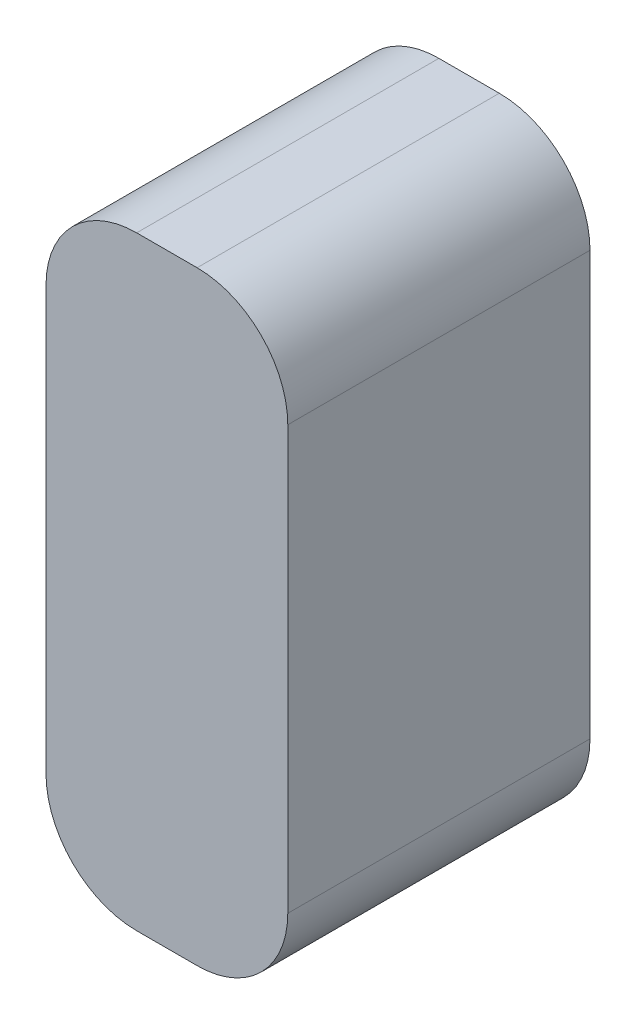
ISO-10303-21;
HEADER;
FILE_DESCRIPTION(('STEP AP214'),'2;1');
FILE_NAME('part.step','',(''),(''),'','','');
FILE_SCHEMA(('AUTOMOTIVE_DESIGN { 1 0 10303 214 1 1 1 1 }'));
ENDSEC;
DATA;
#1=APPLICATION_CONTEXT('core data for automotive mechanical design processes');
#2=APPLICATION_PROTOCOL_DEFINITION('international standard','automotive_design',2000,#1);
#3=PRODUCT_CONTEXT('',#1,'mechanical');
#4=PRODUCT('Part','Part','',(#3));
#5=PRODUCT_RELATED_PRODUCT_CATEGORY('part','',(#4));
#6=PRODUCT_DEFINITION_FORMATION('','',#4);
#7=PRODUCT_DEFINITION_CONTEXT('part definition',#1,'design');
#8=PRODUCT_DEFINITION('design','',#6,#7);
#9=PRODUCT_DEFINITION_SHAPE('','',#8);
#10=(LENGTH_UNIT() NAMED_UNIT(*) SI_UNIT(.MILLI.,.METRE.));
#11=(NAMED_UNIT(*) PLANE_ANGLE_UNIT() SI_UNIT($,.RADIAN.));
#12=(NAMED_UNIT(*) SI_UNIT($,.STERADIAN.) SOLID_ANGLE_UNIT());
#13=UNCERTAINTY_MEASURE_WITH_UNIT(LENGTH_MEASURE(1.E-05),#10,'distance_accuracy_value','');
#14=(GEOMETRIC_REPRESENTATION_CONTEXT(3) GLOBAL_UNCERTAINTY_ASSIGNED_CONTEXT((#13)) GLOBAL_UNIT_ASSIGNED_CONTEXT((#10,
#11,#12)) REPRESENTATION_CONTEXT('',''));
#15=CARTESIAN_POINT('',(0.,0.,0.));
#16=DIRECTION('',(0.,0.,1.));
#17=DIRECTION('',(1.,0.,0.));
#18=AXIS2_PLACEMENT_3D('',#15,#16,#17);
#19=CARTESIAN_POINT('',(-4.,299.,10.));
#20=DIRECTION('',(1.,0.,0.));
#21=DIRECTION('',(0.,1.,0.));
#22=AXIS2_PLACEMENT_3D('',#19,#20,#21);
#23=PLANE('',#22);
#24=DIRECTION('',(0.,-1.,0.));
#25=VECTOR('',#24,1.);
#26=CARTESIAN_POINT('',(-4.,299.,0.));
#27=LINE('',#26,#25);
#28=CARTESIAN_POINT('',(-4.,296.,0.));
#29=VERTEX_POINT('',#28);
#30=CARTESIAN_POINT('',(-4.,282.,0.));
#31=VERTEX_POINT('',#30);
#32=EDGE_CURVE('E130',#29,#31,#27,.T.);
#33=ORIENTED_EDGE('',*,*,#32,.T.);
#34=DIRECTION('',(0.,0.,-1.));
#35=VECTOR('',#34,1.);
#36=CARTESIAN_POINT('',(-4.,282.,10.));
#37=LINE('',#36,#35);
#38=CARTESIAN_POINT('',(-4.,282.,10.));
#39=VERTEX_POINT('',#38);
#40=EDGE_CURVE('E152',#31,#39,#37,.F.);
#41=ORIENTED_EDGE('',*,*,#40,.T.);
#42=DIRECTION('',(0.,-1.,0.));
#43=VECTOR('',#42,1.);
#44=CARTESIAN_POINT('',(-4.,299.,10.));
#45=LINE('',#44,#43);
#46=CARTESIAN_POINT('',(-4.,296.,10.));
#47=VERTEX_POINT('',#46);
#48=EDGE_CURVE('E128',#47,#39,#45,.T.);
#49=ORIENTED_EDGE('',*,*,#48,.F.);
#50=DIRECTION('',(0.,0.,-1.));
#51=VECTOR('',#50,1.);
#52=CARTESIAN_POINT('',(-4.,296.,10.));
#53=LINE('',#52,#51);
#54=EDGE_CURVE('E149',#47,#29,#53,.T.);
#55=ORIENTED_EDGE('',*,*,#54,.T.);
#56=EDGE_LOOP('',(#33,#41,#49,#55));
#57=FACE_BOUND('',#56,.T.);
#58=ADVANCED_FACE('F33',(#57),#23,.F.);
#59=CARTESIAN_POINT('',(-4.,279.,10.));
#60=DIRECTION('',(0.,1.,0.));
#61=DIRECTION('',(0.,0.,1.));
#62=AXIS2_PLACEMENT_3D('',#59,#60,#61);
#63=PLANE('',#62);
#64=DIRECTION('',(1.,0.,0.));
#65=VECTOR('',#64,1.);
#66=CARTESIAN_POINT('',(-4.,279.,0.));
#67=LINE('',#66,#65);
#68=CARTESIAN_POINT('',(-0.999999999999998,279.,0.));
#69=VERTEX_POINT('',#68);
#70=CARTESIAN_POINT('',(1.,279.,0.));
#71=VERTEX_POINT('',#70);
#72=EDGE_CURVE('E126',#69,#71,#67,.T.);
#73=ORIENTED_EDGE('',*,*,#72,.T.);
#74=DIRECTION('',(0.,0.,-1.));
#75=VECTOR('',#74,1.);
#76=CARTESIAN_POINT('',(1.,279.,10.));
#77=LINE('',#76,#75);
#78=CARTESIAN_POINT('',(1.,279.,10.));
#79=VERTEX_POINT('',#78);
#80=EDGE_CURVE('E104',#71,#79,#77,.F.);
#81=ORIENTED_EDGE('',*,*,#80,.T.);
#82=DIRECTION('',(1.,0.,0.));
#83=VECTOR('',#82,1.);
#84=CARTESIAN_POINT('',(-4.,279.,10.));
#85=LINE('',#84,#83);
#86=CARTESIAN_POINT('',(-0.999999999999998,279.,10.));
#87=VERTEX_POINT('',#86);
#88=EDGE_CURVE('E166',#87,#79,#85,.T.);
#89=ORIENTED_EDGE('',*,*,#88,.F.);
#90=DIRECTION('',(0.,0.,-1.));
#91=VECTOR('',#90,1.);
#92=CARTESIAN_POINT('',(-0.999999999999998,279.,10.));
#93=LINE('',#92,#91);
#94=EDGE_CURVE('E109',#87,#69,#93,.T.);
#95=ORIENTED_EDGE('',*,*,#94,.T.);
#96=EDGE_LOOP('',(#73,#81,#89,#95));
#97=FACE_BOUND('',#96,.T.);
#98=ADVANCED_FACE('F171',(#97),#63,.F.);
#99=CARTESIAN_POINT('',(4.,299.,10.));
#100=DIRECTION('',(-1.,0.,0.));
#101=DIRECTION('',(0.,-1.,0.));
#102=AXIS2_PLACEMENT_3D('',#99,#100,#101);
#103=PLANE('',#102);
#104=DIRECTION('',(0.,1.,0.));
#105=VECTOR('',#104,1.);
#106=CARTESIAN_POINT('',(4.,299.,10.));
#107=LINE('',#106,#105);
#108=CARTESIAN_POINT('',(4.,282.,10.));
#109=VERTEX_POINT('',#108);
#110=CARTESIAN_POINT('',(4.,296.,10.));
#111=VERTEX_POINT('',#110);
#112=EDGE_CURVE('E118',#109,#111,#107,.T.);
#113=ORIENTED_EDGE('',*,*,#112,.F.);
#114=DIRECTION('',(0.,0.,-1.));
#115=VECTOR('',#114,1.);
#116=CARTESIAN_POINT('',(4.,282.,10.));
#117=LINE('',#116,#115);
#118=CARTESIAN_POINT('',(4.,282.,0.));
#119=VERTEX_POINT('',#118);
#120=EDGE_CURVE('E103',#109,#119,#117,.T.);
#121=ORIENTED_EDGE('',*,*,#120,.T.);
#122=DIRECTION('',(0.,1.,0.));
#123=VECTOR('',#122,1.);
#124=CARTESIAN_POINT('',(4.,299.,0.));
#125=LINE('',#124,#123);
#126=CARTESIAN_POINT('',(4.,296.,0.));
#127=VERTEX_POINT('',#126);
#128=EDGE_CURVE('E116',#119,#127,#125,.T.);
#129=ORIENTED_EDGE('',*,*,#128,.T.);
#130=DIRECTION('',(0.,0.,-1.));
#131=VECTOR('',#130,1.);
#132=CARTESIAN_POINT('',(4.,296.,10.));
#133=LINE('',#132,#131);
#134=EDGE_CURVE('E120',#127,#111,#133,.F.);
#135=ORIENTED_EDGE('',*,*,#134,.T.);
#136=EDGE_LOOP('',(#113,#121,#129,#135));
#137=FACE_BOUND('',#136,.T.);
#138=ADVANCED_FACE('F115',(#137),#103,.F.);
#139=CARTESIAN_POINT('',(-4.,299.,10.));
#140=DIRECTION('',(0.,-1.,0.));
#141=DIRECTION('',(0.,0.,-1.));
#142=AXIS2_PLACEMENT_3D('',#139,#140,#141);
#143=PLANE('',#142);
#144=DIRECTION('',(-1.,0.,0.));
#145=VECTOR('',#144,1.);
#146=CARTESIAN_POINT('',(-4.,299.,10.));
#147=LINE('',#146,#145);
#148=CARTESIAN_POINT('',(1.,299.,10.));
#149=VERTEX_POINT('',#148);
#150=CARTESIAN_POINT('',(-1.,299.,10.));
#151=VERTEX_POINT('',#150);
#152=EDGE_CURVE('E134',#149,#151,#147,.T.);
#153=ORIENTED_EDGE('',*,*,#152,.F.);
#154=DIRECTION('',(0.,0.,-1.));
#155=VECTOR('',#154,1.);
#156=CARTESIAN_POINT('',(1.,299.,10.));
#157=LINE('',#156,#155);
#158=CARTESIAN_POINT('',(1.,299.,0.));
#159=VERTEX_POINT('',#158);
#160=EDGE_CURVE('E11',#149,#159,#157,.T.);
#161=ORIENTED_EDGE('',*,*,#160,.T.);
#162=DIRECTION('',(-1.,0.,0.));
#163=VECTOR('',#162,1.);
#164=CARTESIAN_POINT('',(-4.,299.,0.));
#165=LINE('',#164,#163);
#166=CARTESIAN_POINT('',(-1.,299.,0.));
#167=VERTEX_POINT('',#166);
#168=EDGE_CURVE('E125',#159,#167,#165,.T.);
#169=ORIENTED_EDGE('',*,*,#168,.T.);
#170=DIRECTION('',(0.,0.,-1.));
#171=VECTOR('',#170,1.);
#172=CARTESIAN_POINT('',(-1.,299.,10.));
#173=LINE('',#172,#171);
#174=EDGE_CURVE('E41',#167,#151,#173,.F.);
#175=ORIENTED_EDGE('',*,*,#174,.T.);
#176=EDGE_LOOP('',(#153,#161,#169,#175));
#177=FACE_BOUND('',#176,.T.);
#178=ADVANCED_FACE('F178',(#177),#143,.F.);
#179=CARTESIAN_POINT('',(0.,0.,10.));
#180=DIRECTION('',(0.,0.,1.));
#181=DIRECTION('',(1.,0.,0.));
#182=AXIS2_PLACEMENT_3D('',#179,#180,#181);
#183=PLANE('',#182);
#184=ORIENTED_EDGE('',*,*,#88,.T.);
#185=CARTESIAN_POINT('',(1.,282.,10.));
#186=DIRECTION('',(0.,0.,1.));
#187=DIRECTION('',(1.,0.,0.));
#188=AXIS2_PLACEMENT_3D('',#185,#186,#187);
#189=CIRCLE('',#188,3.);
#190=EDGE_CURVE('E147',#79,#109,#189,.T.);
#191=ORIENTED_EDGE('',*,*,#190,.T.);
#192=ORIENTED_EDGE('',*,*,#112,.T.);
#193=CARTESIAN_POINT('',(1.,296.,10.));
#194=DIRECTION('',(0.,0.,1.));
#195=DIRECTION('',(1.,0.,0.));
#196=AXIS2_PLACEMENT_3D('',#193,#194,#195);
#197=CIRCLE('',#196,3.);
#198=EDGE_CURVE('E54',#111,#149,#197,.T.);
#199=ORIENTED_EDGE('',*,*,#198,.T.);
#200=ORIENTED_EDGE('',*,*,#152,.T.);
#201=CARTESIAN_POINT('',(-1.,296.,10.));
#202=DIRECTION('',(0.,0.,1.));
#203=DIRECTION('',(1.,0.,0.));
#204=AXIS2_PLACEMENT_3D('',#201,#202,#203);
#205=CIRCLE('',#204,3.);
#206=EDGE_CURVE('E142',#151,#47,#205,.T.);
#207=ORIENTED_EDGE('',*,*,#206,.T.);
#208=ORIENTED_EDGE('',*,*,#48,.T.);
#209=CARTESIAN_POINT('',(-0.999999999999998,282.,10.));
#210=DIRECTION('',(0.,0.,1.));
#211=DIRECTION('',(1.,0.,0.));
#212=AXIS2_PLACEMENT_3D('',#209,#210,#211);
#213=CIRCLE('',#212,3.);
#214=EDGE_CURVE('E145',#39,#87,#213,.T.);
#215=ORIENTED_EDGE('',*,*,#214,.T.);
#216=EDGE_LOOP('',(#184,#191,#192,#199,#200,#207,#208,#215));
#217=FACE_BOUND('',#216,.T.);
#218=ADVANCED_FACE('F163',(#217),#183,.T.);
#219=CARTESIAN_POINT('',(0.,0.,0.));
#220=DIRECTION('',(0.,0.,1.));
#221=DIRECTION('',(1.,0.,0.));
#222=AXIS2_PLACEMENT_3D('',#219,#220,#221);
#223=PLANE('',#222);
#224=ORIENTED_EDGE('',*,*,#128,.F.);
#225=CARTESIAN_POINT('',(1.,282.,0.));
#226=DIRECTION('',(0.,0.,1.));
#227=DIRECTION('',(1.,0.,0.));
#228=AXIS2_PLACEMENT_3D('',#225,#226,#227);
#229=CIRCLE('',#228,3.);
#230=EDGE_CURVE('E99',#119,#71,#229,.F.);
#231=ORIENTED_EDGE('',*,*,#230,.T.);
#232=ORIENTED_EDGE('',*,*,#72,.F.);
#233=CARTESIAN_POINT('',(-0.999999999999998,282.,0.));
#234=DIRECTION('',(0.,0.,1.));
#235=DIRECTION('',(1.,0.,0.));
#236=AXIS2_PLACEMENT_3D('',#233,#234,#235);
#237=CIRCLE('',#236,3.);
#238=EDGE_CURVE('E110',#69,#31,#237,.F.);
#239=ORIENTED_EDGE('',*,*,#238,.T.);
#240=ORIENTED_EDGE('',*,*,#32,.F.);
#241=CARTESIAN_POINT('',(-1.,296.,0.));
#242=DIRECTION('',(0.,0.,1.));
#243=DIRECTION('',(1.,0.,0.));
#244=AXIS2_PLACEMENT_3D('',#241,#242,#243);
#245=CIRCLE('',#244,3.);
#246=EDGE_CURVE('E119',#29,#167,#245,.F.);
#247=ORIENTED_EDGE('',*,*,#246,.T.);
#248=ORIENTED_EDGE('',*,*,#168,.F.);
#249=CARTESIAN_POINT('',(1.,296.,0.));
#250=DIRECTION('',(0.,0.,1.));
#251=DIRECTION('',(1.,0.,0.));
#252=AXIS2_PLACEMENT_3D('',#249,#250,#251);
#253=CIRCLE('',#252,3.);
#254=EDGE_CURVE('E124',#159,#127,#253,.F.);
#255=ORIENTED_EDGE('',*,*,#254,.T.);
#256=EDGE_LOOP('',(#224,#231,#232,#239,#240,#247,#248,#255));
#257=FACE_BOUND('',#256,.T.);
#258=ADVANCED_FACE('F122',(#257),#223,.F.);
#259=CARTESIAN_POINT('',(1.,282.,10.));
#260=DIRECTION('',(0.,0.,-1.));
#261=DIRECTION('',(-1.,0.,0.));
#262=AXIS2_PLACEMENT_3D('',#259,#260,#261);
#263=CYLINDRICAL_SURFACE('',#262,3.);
#264=ORIENTED_EDGE('',*,*,#190,.F.);
#265=ORIENTED_EDGE('',*,*,#80,.F.);
#266=ORIENTED_EDGE('',*,*,#230,.F.);
#267=ORIENTED_EDGE('',*,*,#120,.F.);
#268=EDGE_LOOP('',(#264,#265,#266,#267));
#269=FACE_BOUND('',#268,.T.);
#270=ADVANCED_FACE('F102',(#269),#263,.T.);
#271=CARTESIAN_POINT('',(-0.999999999999998,282.,10.));
#272=DIRECTION('',(0.,0.,-1.));
#273=DIRECTION('',(-1.,0.,0.));
#274=AXIS2_PLACEMENT_3D('',#271,#272,#273);
#275=CYLINDRICAL_SURFACE('',#274,3.);
#276=ORIENTED_EDGE('',*,*,#214,.F.);
#277=ORIENTED_EDGE('',*,*,#40,.F.);
#278=ORIENTED_EDGE('',*,*,#238,.F.);
#279=ORIENTED_EDGE('',*,*,#94,.F.);
#280=EDGE_LOOP('',(#276,#277,#278,#279));
#281=FACE_BOUND('',#280,.T.);
#282=ADVANCED_FACE('F169',(#281),#275,.T.);
#283=CARTESIAN_POINT('',(1.,296.,10.));
#284=DIRECTION('',(0.,0.,-1.));
#285=DIRECTION('',(-1.,0.,0.));
#286=AXIS2_PLACEMENT_3D('',#283,#284,#285);
#287=CYLINDRICAL_SURFACE('',#286,3.);
#288=ORIENTED_EDGE('',*,*,#198,.F.);
#289=ORIENTED_EDGE('',*,*,#134,.F.);
#290=ORIENTED_EDGE('',*,*,#254,.F.);
#291=ORIENTED_EDGE('',*,*,#160,.F.);
#292=EDGE_LOOP('',(#288,#289,#290,#291));
#293=FACE_BOUND('',#292,.T.);
#294=ADVANCED_FACE('F177',(#293),#287,.T.);
#295=CARTESIAN_POINT('',(-1.,296.,10.));
#296=DIRECTION('',(0.,0.,-1.));
#297=DIRECTION('',(-1.,0.,0.));
#298=AXIS2_PLACEMENT_3D('',#295,#296,#297);
#299=CYLINDRICAL_SURFACE('',#298,3.);
#300=ORIENTED_EDGE('',*,*,#206,.F.);
#301=ORIENTED_EDGE('',*,*,#174,.F.);
#302=ORIENTED_EDGE('',*,*,#246,.F.);
#303=ORIENTED_EDGE('',*,*,#54,.F.);
#304=EDGE_LOOP('',(#300,#301,#302,#303));
#305=FACE_BOUND('',#304,.T.);
#306=ADVANCED_FACE('F35',(#305),#299,.T.);
#307=CLOSED_SHELL('',(#58,#98,#138,#178,#218,#258,#270,#282,#294,#306));
#308=MANIFOLD_SOLID_BREP('B2',#307);
#309=ADVANCED_BREP_SHAPE_REPRESENTATION('',(#18,#308),#14);
#310=SHAPE_DEFINITION_REPRESENTATION(#9,#309);
ENDSEC;
END-ISO-10303-21;
